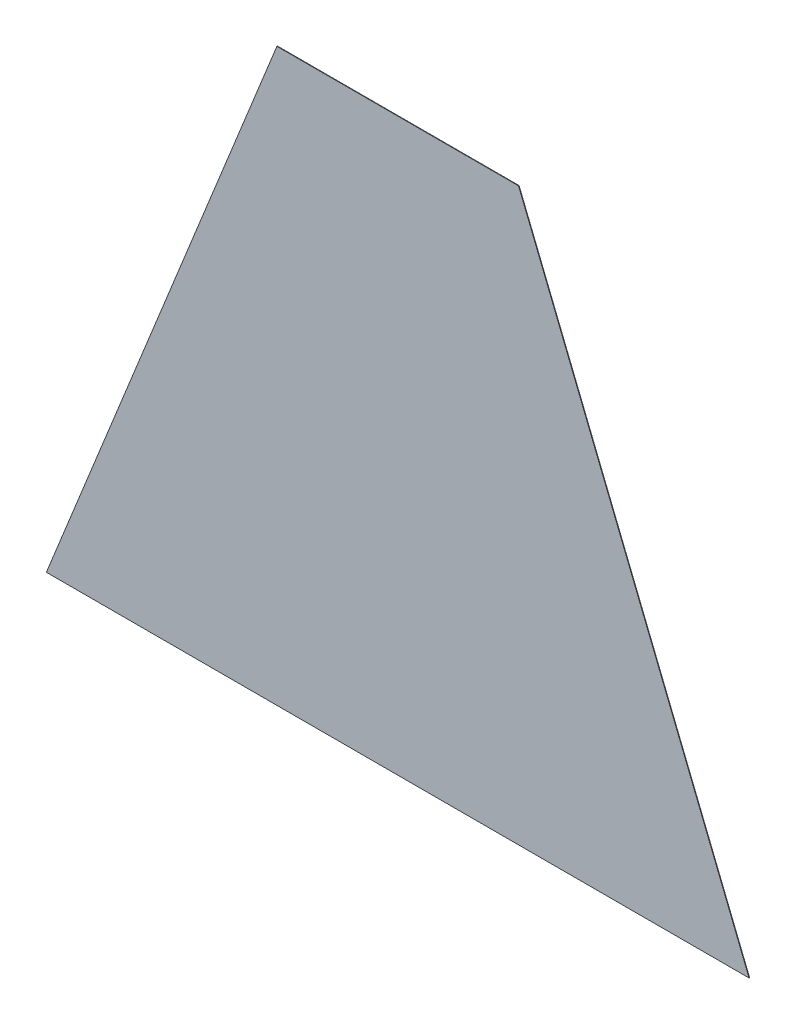
ISO-10303-21;
HEADER;
FILE_DESCRIPTION(('STEP AP214'),'2;1');
FILE_NAME('part.step','',(''),(''),'','','');
FILE_SCHEMA(('AUTOMOTIVE_DESIGN { 1 0 10303 214 1 1 1 1 }'));
ENDSEC;
DATA;
#1=APPLICATION_CONTEXT('core data for automotive mechanical design processes');
#2=APPLICATION_PROTOCOL_DEFINITION('international standard','automotive_design',2000,#1);
#3=PRODUCT_CONTEXT('',#1,'mechanical');
#4=PRODUCT('Part','Part','',(#3));
#5=PRODUCT_RELATED_PRODUCT_CATEGORY('part','',(#4));
#6=PRODUCT_DEFINITION_FORMATION('','',#4);
#7=PRODUCT_DEFINITION_CONTEXT('part definition',#1,'design');
#8=PRODUCT_DEFINITION('design','',#6,#7);
#9=PRODUCT_DEFINITION_SHAPE('','',#8);
#10=(LENGTH_UNIT() NAMED_UNIT(*) SI_UNIT(.MILLI.,.METRE.));
#11=(NAMED_UNIT(*) PLANE_ANGLE_UNIT() SI_UNIT($,.RADIAN.));
#12=(NAMED_UNIT(*) SI_UNIT($,.STERADIAN.) SOLID_ANGLE_UNIT());
#13=UNCERTAINTY_MEASURE_WITH_UNIT(LENGTH_MEASURE(1.E-05),#10,'distance_accuracy_value','');
#14=(GEOMETRIC_REPRESENTATION_CONTEXT(3) GLOBAL_UNCERTAINTY_ASSIGNED_CONTEXT((#13)) GLOBAL_UNIT_ASSIGNED_CONTEXT((#10,
#11,#12)) REPRESENTATION_CONTEXT('',''));
#15=CARTESIAN_POINT('',(0.,0.,0.));
#16=DIRECTION('',(0.,0.,1.));
#17=DIRECTION('',(1.,0.,0.));
#18=AXIS2_PLACEMENT_3D('',#15,#16,#17);
#19=CARTESIAN_POINT('',(-15.6754706226245,3910.72857005921,2.54));
#20=DIRECTION('',(0.,-1.,0.));
#21=DIRECTION('',(0.,0.,-1.));
#22=AXIS2_PLACEMENT_3D('',#19,#20,#21);
#23=PLANE('',#22);
#24=DIRECTION('',(-1.,0.,0.));
#25=VECTOR('',#24,1.);
#26=CARTESIAN_POINT('',(-15.6754706226245,3910.72857005921,0.));
#27=LINE('',#26,#25);
#28=CARTESIAN_POINT('',(1130.84269143322,3910.72857005921,0.));
#29=VERTEX_POINT('',#28);
#30=CARTESIAN_POINT('',(-15.6754706226245,3910.72857005921,0.));
#31=VERTEX_POINT('',#30);
#32=EDGE_CURVE('E102',#29,#31,#27,.T.);
#33=ORIENTED_EDGE('',*,*,#32,.T.);
#34=DIRECTION('',(0.,0.,-1.));
#35=VECTOR('',#34,1.);
#36=CARTESIAN_POINT('',(-15.6754706226245,3910.72857005921,2.54));
#37=LINE('',#36,#35);
#38=CARTESIAN_POINT('',(-15.6754706226245,3910.72857005921,2.54));
#39=VERTEX_POINT('',#38);
#40=EDGE_CURVE('E11',#39,#31,#37,.T.);
#41=ORIENTED_EDGE('',*,*,#40,.F.);
#42=DIRECTION('',(-1.,0.,0.));
#43=VECTOR('',#42,1.);
#44=CARTESIAN_POINT('',(-15.6754706226245,3910.72857005921,2.54));
#45=LINE('',#44,#43);
#46=CARTESIAN_POINT('',(1130.84269143322,3910.72857005921,2.54));
#47=VERTEX_POINT('',#46);
#48=EDGE_CURVE('E90',#47,#39,#45,.T.);
#49=ORIENTED_EDGE('',*,*,#48,.F.);
#50=DIRECTION('',(0.,0.,-1.));
#51=VECTOR('',#50,1.);
#52=CARTESIAN_POINT('',(1130.84269143322,3910.72857005921,2.54));
#53=LINE('',#52,#51);
#54=EDGE_CURVE('E98',#47,#29,#53,.T.);
#55=ORIENTED_EDGE('',*,*,#54,.T.);
#56=EDGE_LOOP('',(#33,#41,#49,#55));
#57=FACE_BOUND('',#56,.T.);
#58=ADVANCED_FACE('F39',(#57),#23,.F.);
#59=CARTESIAN_POINT('',(-15.6754706226245,3910.72857005921,2.54));
#60=DIRECTION('',(0.92722537783793,-0.374503803309536,0.));
#61=DIRECTION('',(0.374503803309536,0.92722537783793,0.));
#62=AXIS2_PLACEMENT_3D('',#59,#60,#61);
#63=PLANE('',#62);
#64=DIRECTION('',(-0.374503803309536,-0.92722537783793,0.));
#65=VECTOR('',#64,1.);
#66=CARTESIAN_POINT('',(-15.6754706226245,3910.72857005921,0.));
#67=LINE('',#66,#65);
#68=CARTESIAN_POINT('',(-1109.41456132556,1202.76503892537,0.));
#69=VERTEX_POINT('',#68);
#70=EDGE_CURVE('E94',#31,#69,#67,.T.);
#71=ORIENTED_EDGE('',*,*,#70,.T.);
#72=DIRECTION('',(0.,0.,-1.));
#73=VECTOR('',#72,1.);
#74=CARTESIAN_POINT('',(-1109.41456132556,1202.76503892537,2.54));
#75=LINE('',#74,#73);
#76=CARTESIAN_POINT('',(-1109.41456132556,1202.76503892537,2.54));
#77=VERTEX_POINT('',#76);
#78=EDGE_CURVE('E47',#77,#69,#75,.T.);
#79=ORIENTED_EDGE('',*,*,#78,.F.);
#80=DIRECTION('',(-0.374503803309536,-0.92722537783793,0.));
#81=VECTOR('',#80,1.);
#82=CARTESIAN_POINT('',(-15.6754706226245,3910.72857005921,2.54));
#83=LINE('',#82,#81);
#84=EDGE_CURVE('E85',#39,#77,#83,.T.);
#85=ORIENTED_EDGE('',*,*,#84,.F.);
#86=ORIENTED_EDGE('',*,*,#40,.T.);
#87=EDGE_LOOP('',(#71,#79,#85,#86));
#88=FACE_BOUND('',#87,.T.);
#89=ADVANCED_FACE('F93',(#88),#63,.F.);
#90=CARTESIAN_POINT('',(-1109.41456132556,1202.76503892537,2.54));
#91=DIRECTION('',(0.,1.,0.));
#92=DIRECTION('',(0.,0.,1.));
#93=AXIS2_PLACEMENT_3D('',#90,#91,#92);
#94=PLANE('',#93);
#95=DIRECTION('',(1.,0.,0.));
#96=VECTOR('',#95,1.);
#97=CARTESIAN_POINT('',(-1109.41456132556,1202.76503892537,0.));
#98=LINE('',#97,#96);
#99=CARTESIAN_POINT('',(2224.58178213617,1202.76503892537,0.));
#100=VERTEX_POINT('',#99);
#101=EDGE_CURVE('E72',#69,#100,#98,.T.);
#102=ORIENTED_EDGE('',*,*,#101,.T.);
#103=DIRECTION('',(0.,0.,-1.));
#104=VECTOR('',#103,1.);
#105=CARTESIAN_POINT('',(2224.58178213617,1202.76503892537,2.54));
#106=LINE('',#105,#104);
#107=CARTESIAN_POINT('',(2224.58178213617,1202.76503892537,2.54));
#108=VERTEX_POINT('',#107);
#109=EDGE_CURVE('E95',#108,#100,#106,.T.);
#110=ORIENTED_EDGE('',*,*,#109,.F.);
#111=DIRECTION('',(1.,0.,0.));
#112=VECTOR('',#111,1.);
#113=CARTESIAN_POINT('',(-1109.41456132556,1202.76503892537,2.54));
#114=LINE('',#113,#112);
#115=EDGE_CURVE('E88',#77,#108,#114,.T.);
#116=ORIENTED_EDGE('',*,*,#115,.F.);
#117=ORIENTED_EDGE('',*,*,#78,.T.);
#118=EDGE_LOOP('',(#102,#110,#116,#117));
#119=FACE_BOUND('',#118,.T.);
#120=ADVANCED_FACE('F96',(#119),#94,.F.);
#121=CARTESIAN_POINT('',(2224.58178213617,1202.76503892537,2.54));
#122=DIRECTION('',(-0.927225377837929,-0.37450380330954,0.));
#123=DIRECTION('',(0.37450380330954,-0.927225377837929,0.));
#124=AXIS2_PLACEMENT_3D('',#121,#122,#123);
#125=PLANE('',#124);
#126=DIRECTION('',(-0.37450380330954,0.927225377837929,0.));
#127=VECTOR('',#126,1.);
#128=CARTESIAN_POINT('',(2224.58178213617,1202.76503892537,0.));
#129=LINE('',#128,#127);
#130=EDGE_CURVE('E78',#100,#29,#129,.T.);
#131=ORIENTED_EDGE('',*,*,#130,.T.);
#132=ORIENTED_EDGE('',*,*,#54,.F.);
#133=DIRECTION('',(-0.37450380330954,0.927225377837929,0.));
#134=VECTOR('',#133,1.);
#135=CARTESIAN_POINT('',(2224.58178213617,1202.76503892537,2.54));
#136=LINE('',#135,#134);
#137=EDGE_CURVE('E55',#108,#47,#136,.T.);
#138=ORIENTED_EDGE('',*,*,#137,.F.);
#139=ORIENTED_EDGE('',*,*,#109,.T.);
#140=EDGE_LOOP('',(#131,#132,#138,#139));
#141=FACE_BOUND('',#140,.T.);
#142=ADVANCED_FACE('F109',(#141),#125,.F.);
#143=CARTESIAN_POINT('',(0.,0.,2.54));
#144=DIRECTION('',(0.,0.,1.));
#145=DIRECTION('',(1.,0.,0.));
#146=AXIS2_PLACEMENT_3D('',#143,#144,#145);
#147=PLANE('',#146);
#148=ORIENTED_EDGE('',*,*,#48,.T.);
#149=ORIENTED_EDGE('',*,*,#84,.T.);
#150=ORIENTED_EDGE('',*,*,#115,.T.);
#151=ORIENTED_EDGE('',*,*,#137,.T.);
#152=EDGE_LOOP('',(#148,#149,#150,#151));
#153=FACE_BOUND('',#152,.T.);
#154=ADVANCED_FACE('F86',(#153),#147,.T.);
#155=CARTESIAN_POINT('',(0.,0.,0.));
#156=DIRECTION('',(0.,0.,1.));
#157=DIRECTION('',(1.,0.,0.));
#158=AXIS2_PLACEMENT_3D('',#155,#156,#157);
#159=PLANE('',#158);
#160=ORIENTED_EDGE('',*,*,#32,.F.);
#161=ORIENTED_EDGE('',*,*,#130,.F.);
#162=ORIENTED_EDGE('',*,*,#101,.F.);
#163=ORIENTED_EDGE('',*,*,#70,.F.);
#164=EDGE_LOOP('',(#160,#161,#162,#163));
#165=FACE_BOUND('',#164,.T.);
#166=ADVANCED_FACE('F112',(#165),#159,.F.);
#167=CLOSED_SHELL('',(#58,#89,#120,#142,#154,#166));
#168=MANIFOLD_SOLID_BREP('B2',#167);
#169=ADVANCED_BREP_SHAPE_REPRESENTATION('',(#18,#168),#14);
#170=SHAPE_DEFINITION_REPRESENTATION(#9,#169);
ENDSEC;
END-ISO-10303-21;
